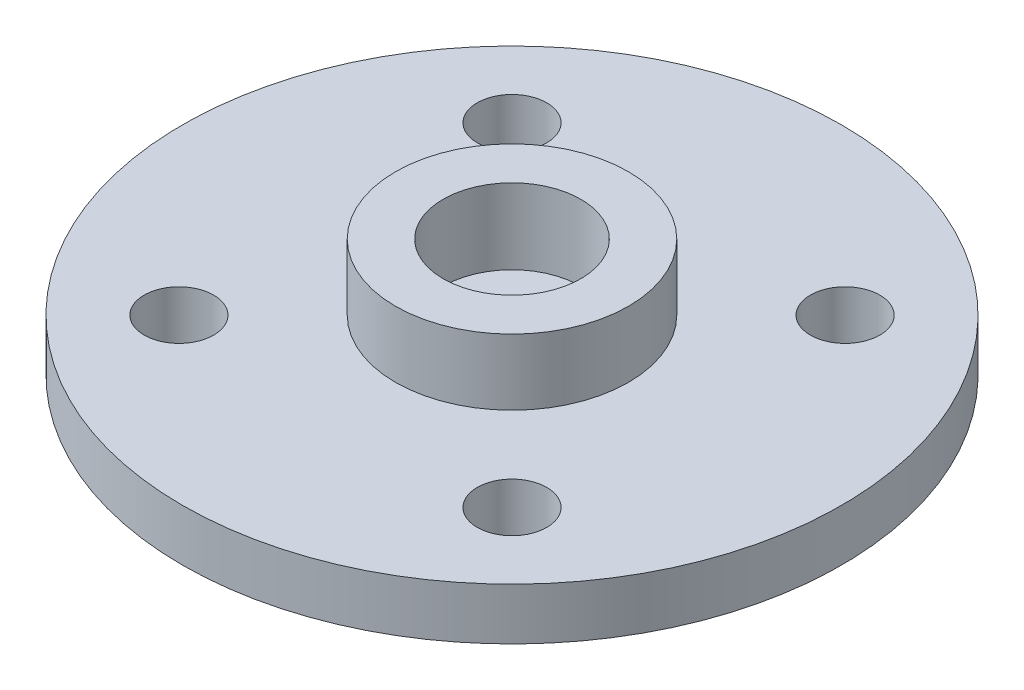
ISO-10303-21;
HEADER;
FILE_DESCRIPTION(('STEP AP214'),'2;1');
FILE_NAME('part.step','',(''),(''),'','','');
FILE_SCHEMA(('AUTOMOTIVE_DESIGN { 1 0 10303 214 1 1 1 1 }'));
ENDSEC;
DATA;
#1=APPLICATION_CONTEXT('core data for automotive mechanical design processes');
#2=APPLICATION_PROTOCOL_DEFINITION('international standard','automotive_design',2000,#1);
#3=PRODUCT_CONTEXT('',#1,'mechanical');
#4=PRODUCT('Part','Part','',(#3));
#5=PRODUCT_RELATED_PRODUCT_CATEGORY('part','',(#4));
#6=PRODUCT_DEFINITION_FORMATION('','',#4);
#7=PRODUCT_DEFINITION_CONTEXT('part definition',#1,'design');
#8=PRODUCT_DEFINITION('design','',#6,#7);
#9=PRODUCT_DEFINITION_SHAPE('','',#8);
#10=(LENGTH_UNIT() NAMED_UNIT(*) SI_UNIT(.MILLI.,.METRE.));
#11=(NAMED_UNIT(*) PLANE_ANGLE_UNIT() SI_UNIT($,.RADIAN.));
#12=(NAMED_UNIT(*) SI_UNIT($,.STERADIAN.) SOLID_ANGLE_UNIT());
#13=UNCERTAINTY_MEASURE_WITH_UNIT(LENGTH_MEASURE(1.E-05),#10,'distance_accuracy_value','');
#14=(GEOMETRIC_REPRESENTATION_CONTEXT(3) GLOBAL_UNCERTAINTY_ASSIGNED_CONTEXT((#13)) GLOBAL_UNIT_ASSIGNED_CONTEXT((#10,
#11,#12)) REPRESENTATION_CONTEXT('',''));
#15=CARTESIAN_POINT('',(0.,0.,0.));
#16=DIRECTION('',(0.,0.,1.));
#17=DIRECTION('',(1.,0.,0.));
#18=AXIS2_PLACEMENT_3D('',#15,#16,#17);
#19=CARTESIAN_POINT('',(0.,5.,0.));
#20=DIRECTION('',(0.,-1.,0.));
#21=DIRECTION('',(0.,0.,-1.));
#22=AXIS2_PLACEMENT_3D('',#19,#20,#21);
#23=CYLINDRICAL_SURFACE('',#22,1.5);
#24=DIRECTION('',(0.,-1.,0.));
#25=VECTOR('',#24,1.);
#26=CARTESIAN_POINT('',(-0.0834626338555483,5.,1.49767619622864));
#27=LINE('',#26,#25);
#28=CARTESIAN_POINT('',(-0.0834626338555482,1.,1.49767619622864));
#29=VERTEX_POINT('',#28);
#30=CARTESIAN_POINT('',(-0.0834626338555481,0.,1.49767619622864));
#31=VERTEX_POINT('',#30);
#32=EDGE_CURVE('E107',#29,#31,#27,.T.);
#33=ORIENTED_EDGE('',*,*,#32,.F.);
#34=CARTESIAN_POINT('',(0.,1.,0.));
#35=DIRECTION('',(0.,1.,0.));
#36=DIRECTION('',(0.,0.,1.));
#37=AXIS2_PLACEMENT_3D('',#34,#35,#36);
#38=CIRCLE('',#37,1.5);
#39=CARTESIAN_POINT('',(-1.49767619622864,1.,0.0834626338555488));
#40=VERTEX_POINT('',#39);
#41=EDGE_CURVE('E11',#40,#29,#38,.T.);
#42=ORIENTED_EDGE('',*,*,#41,.F.);
#43=DIRECTION('',(0.,-1.,0.));
#44=VECTOR('',#43,1.);
#45=CARTESIAN_POINT('',(-1.49767619622864,5.,0.0834626338555488));
#46=LINE('',#45,#44);
#47=CARTESIAN_POINT('',(-1.49767619622864,0.,0.0834626338555488));
#48=VERTEX_POINT('',#47);
#49=EDGE_CURVE('E104',#48,#40,#46,.F.);
#50=ORIENTED_EDGE('',*,*,#49,.F.);
#51=CARTESIAN_POINT('',(0.,0.,0.));
#52=DIRECTION('',(0.,1.,0.));
#53=DIRECTION('',(0.,0.,1.));
#54=AXIS2_PLACEMENT_3D('',#51,#52,#53);
#55=CIRCLE('',#54,1.5);
#56=EDGE_CURVE('E120',#31,#48,#55,.T.);
#57=ORIENTED_EDGE('',*,*,#56,.F.);
#58=EDGE_LOOP('',(#33,#42,#50,#57));
#59=FACE_BOUND('',#58,.T.);
#60=CARTESIAN_POINT('',(0.,1.8,0.));
#61=DIRECTION('',(0.,1.,0.));
#62=DIRECTION('',(0.,0.,1.));
#63=AXIS2_PLACEMENT_3D('',#60,#61,#62);
#64=CIRCLE('',#63,1.5);
#65=CARTESIAN_POINT('',(0.,1.8,1.5));
#66=VERTEX_POINT('',#65);
#67=EDGE_CURVE('E113',#66,#66,#64,.T.);
#68=ORIENTED_EDGE('',*,*,#67,.T.);
#69=EDGE_LOOP('',(#68));
#70=FACE_BOUND('',#69,.T.);
#71=ADVANCED_FACE('F43',(#59,#70),#23,.F.);
#72=CARTESIAN_POINT('',(0.,2.2,0.));
#73=DIRECTION('',(0.,-1.,0.));
#74=DIRECTION('',(0.,0.,-1.));
#75=AXIS2_PLACEMENT_3D('',#72,#73,#74);
#76=CYLINDRICAL_SURFACE('',#75,14.);
#77=CARTESIAN_POINT('',(0.,2.2,0.));
#78=DIRECTION('',(0.,1.,0.));
#79=DIRECTION('',(0.,0.,1.));
#80=AXIS2_PLACEMENT_3D('',#77,#78,#79);
#81=CIRCLE('',#80,14.);
#82=CARTESIAN_POINT('',(0.,2.2,14.));
#83=VERTEX_POINT('',#82);
#84=EDGE_CURVE('E136',#83,#83,#81,.T.);
#85=ORIENTED_EDGE('',*,*,#84,.F.);
#86=EDGE_LOOP('',(#85));
#87=FACE_BOUND('',#86,.T.);
#88=CARTESIAN_POINT('',(0.,0.,0.));
#89=DIRECTION('',(0.,1.,0.));
#90=DIRECTION('',(0.,0.,1.));
#91=AXIS2_PLACEMENT_3D('',#88,#89,#90);
#92=CIRCLE('',#91,14.);
#93=CARTESIAN_POINT('',(0.,0.,14.));
#94=VERTEX_POINT('',#93);
#95=EDGE_CURVE('E150',#94,#94,#92,.T.);
#96=ORIENTED_EDGE('',*,*,#95,.T.);
#97=EDGE_LOOP('',(#96));
#98=FACE_BOUND('',#97,.T.);
#99=ADVANCED_FACE('F176',(#87,#98),#76,.T.);
#100=CARTESIAN_POINT('',(-7.075,2.2,-7.07500000000002));
#101=DIRECTION('',(0.,-1.,0.));
#102=DIRECTION('',(0.,0.,-1.));
#103=AXIS2_PLACEMENT_3D('',#100,#101,#102);
#104=CYLINDRICAL_SURFACE('',#103,1.475);
#105=CARTESIAN_POINT('',(-7.075,2.2,-7.07500000000002));
#106=DIRECTION('',(0.,1.,0.));
#107=DIRECTION('',(0.,0.,1.));
#108=AXIS2_PLACEMENT_3D('',#105,#106,#107);
#109=CIRCLE('',#108,1.475);
#110=CARTESIAN_POINT('',(-7.075,2.2,-5.60000000000002));
#111=VERTEX_POINT('',#110);
#112=EDGE_CURVE('E133',#111,#111,#109,.T.);
#113=ORIENTED_EDGE('',*,*,#112,.T.);
#114=EDGE_LOOP('',(#113));
#115=FACE_BOUND('',#114,.T.);
#116=CARTESIAN_POINT('',(-7.075,0.,-7.07500000000002));
#117=DIRECTION('',(0.,1.,0.));
#118=DIRECTION('',(0.,0.,1.));
#119=AXIS2_PLACEMENT_3D('',#116,#117,#118);
#120=CIRCLE('',#119,1.475);
#121=CARTESIAN_POINT('',(-7.075,0.,-5.60000000000002));
#122=VERTEX_POINT('',#121);
#123=EDGE_CURVE('E147',#122,#122,#120,.T.);
#124=ORIENTED_EDGE('',*,*,#123,.F.);
#125=EDGE_LOOP('',(#124));
#126=FACE_BOUND('',#125,.T.);
#127=ADVANCED_FACE('F181',(#115,#126),#104,.F.);
#128=CARTESIAN_POINT('',(7.075,2.2,-7.07500000000003));
#129=DIRECTION('',(0.,-1.,0.));
#130=DIRECTION('',(0.,0.,-1.));
#131=AXIS2_PLACEMENT_3D('',#128,#129,#130);
#132=CYLINDRICAL_SURFACE('',#131,1.475);
#133=CARTESIAN_POINT('',(7.075,2.2,-7.07500000000003));
#134=DIRECTION('',(0.,1.,0.));
#135=DIRECTION('',(0.,0.,1.));
#136=AXIS2_PLACEMENT_3D('',#133,#134,#135);
#137=CIRCLE('',#136,1.475);
#138=CARTESIAN_POINT('',(7.075,2.2,-5.60000000000002));
#139=VERTEX_POINT('',#138);
#140=EDGE_CURVE('E126',#139,#139,#137,.T.);
#141=ORIENTED_EDGE('',*,*,#140,.T.);
#142=EDGE_LOOP('',(#141));
#143=FACE_BOUND('',#142,.T.);
#144=CARTESIAN_POINT('',(7.075,0.,-7.07500000000003));
#145=DIRECTION('',(0.,1.,0.));
#146=DIRECTION('',(0.,0.,1.));
#147=AXIS2_PLACEMENT_3D('',#144,#145,#146);
#148=CIRCLE('',#147,1.475);
#149=CARTESIAN_POINT('',(7.075,0.,-5.60000000000002));
#150=VERTEX_POINT('',#149);
#151=EDGE_CURVE('E144',#150,#150,#148,.T.);
#152=ORIENTED_EDGE('',*,*,#151,.F.);
#153=EDGE_LOOP('',(#152));
#154=FACE_BOUND('',#153,.T.);
#155=ADVANCED_FACE('F200',(#143,#154),#132,.F.);
#156=CARTESIAN_POINT('',(7.075,2.2,7.07500000000003));
#157=DIRECTION('',(0.,-1.,0.));
#158=DIRECTION('',(0.,0.,-1.));
#159=AXIS2_PLACEMENT_3D('',#156,#157,#158);
#160=CYLINDRICAL_SURFACE('',#159,1.475);
#161=CARTESIAN_POINT('',(7.075,2.2,7.07500000000003));
#162=DIRECTION('',(0.,1.,0.));
#163=DIRECTION('',(0.,0.,1.));
#164=AXIS2_PLACEMENT_3D('',#161,#162,#163);
#165=CIRCLE('',#164,1.475);
#166=CARTESIAN_POINT('',(7.075,2.2,8.55000000000002));
#167=VERTEX_POINT('',#166);
#168=EDGE_CURVE('E123',#167,#167,#165,.F.);
#169=ORIENTED_EDGE('',*,*,#168,.F.);
#170=EDGE_LOOP('',(#169));
#171=FACE_BOUND('',#170,.T.);
#172=CARTESIAN_POINT('',(7.075,0.,7.07500000000003));
#173=DIRECTION('',(0.,1.,0.));
#174=DIRECTION('',(0.,0.,1.));
#175=AXIS2_PLACEMENT_3D('',#172,#173,#174);
#176=CIRCLE('',#175,1.475);
#177=CARTESIAN_POINT('',(7.075,0.,8.55000000000002));
#178=VERTEX_POINT('',#177);
#179=EDGE_CURVE('E119',#178,#178,#176,.F.);
#180=ORIENTED_EDGE('',*,*,#179,.T.);
#181=EDGE_LOOP('',(#180));
#182=FACE_BOUND('',#181,.T.);
#183=ADVANCED_FACE('F45',(#171,#182),#160,.F.);
#184=CARTESIAN_POINT('',(-7.075,2.2,7.07500000000002));
#185=DIRECTION('',(0.,-1.,0.));
#186=DIRECTION('',(0.,0.,-1.));
#187=AXIS2_PLACEMENT_3D('',#184,#185,#186);
#188=CYLINDRICAL_SURFACE('',#187,1.475);
#189=CARTESIAN_POINT('',(-7.075,2.2,7.07500000000002));
#190=DIRECTION('',(0.,1.,0.));
#191=DIRECTION('',(0.,0.,1.));
#192=AXIS2_PLACEMENT_3D('',#189,#190,#191);
#193=CIRCLE('',#192,1.475);
#194=CARTESIAN_POINT('',(-7.075,2.2,8.55000000000002));
#195=VERTEX_POINT('',#194);
#196=EDGE_CURVE('E139',#195,#195,#193,.F.);
#197=ORIENTED_EDGE('',*,*,#196,.F.);
#198=EDGE_LOOP('',(#197));
#199=FACE_BOUND('',#198,.T.);
#200=CARTESIAN_POINT('',(-7.075,0.,7.07500000000002));
#201=DIRECTION('',(0.,1.,0.));
#202=DIRECTION('',(0.,0.,1.));
#203=AXIS2_PLACEMENT_3D('',#200,#201,#202);
#204=CIRCLE('',#203,1.475);
#205=CARTESIAN_POINT('',(-7.075,0.,8.55000000000002));
#206=VERTEX_POINT('',#205);
#207=EDGE_CURVE('E127',#206,#206,#204,.F.);
#208=ORIENTED_EDGE('',*,*,#207,.T.);
#209=EDGE_LOOP('',(#208));
#210=FACE_BOUND('',#209,.T.);
#211=ADVANCED_FACE('F191',(#199,#210),#188,.F.);
#212=CARTESIAN_POINT('',(0.,2.2,0.));
#213=DIRECTION('',(0.,1.,0.));
#214=DIRECTION('',(0.,0.,1.));
#215=AXIS2_PLACEMENT_3D('',#212,#213,#214);
#216=PLANE('',#215);
#217=ORIENTED_EDGE('',*,*,#168,.T.);
#218=EDGE_LOOP('',(#217));
#219=FACE_BOUND('',#218,.T.);
#220=ORIENTED_EDGE('',*,*,#140,.F.);
#221=EDGE_LOOP('',(#220));
#222=FACE_BOUND('',#221,.T.);
#223=CARTESIAN_POINT('',(0.,2.2,0.));
#224=DIRECTION('',(0.,1.,0.));
#225=DIRECTION('',(0.,0.,1.));
#226=AXIS2_PLACEMENT_3D('',#223,#224,#225);
#227=CIRCLE('',#226,4.95);
#228=CARTESIAN_POINT('',(0.,2.2,4.95));
#229=VERTEX_POINT('',#228);
#230=EDGE_CURVE('E130',#229,#229,#227,.T.);
#231=ORIENTED_EDGE('',*,*,#230,.F.);
#232=EDGE_LOOP('',(#231));
#233=FACE_BOUND('',#232,.T.);
#234=ORIENTED_EDGE('',*,*,#112,.F.);
#235=EDGE_LOOP('',(#234));
#236=FACE_BOUND('',#235,.T.);
#237=ORIENTED_EDGE('',*,*,#84,.T.);
#238=EDGE_LOOP('',(#237));
#239=FACE_BOUND('',#238,.T.);
#240=ORIENTED_EDGE('',*,*,#196,.T.);
#241=EDGE_LOOP('',(#240));
#242=FACE_BOUND('',#241,.T.);
#243=ADVANCED_FACE('F188',(#219,#222,#233,#236,#239,#242),#216,.T.);
#244=CARTESIAN_POINT('',(0.,0.,0.));
#245=DIRECTION('',(0.,1.,0.));
#246=DIRECTION('',(0.,0.,1.));
#247=AXIS2_PLACEMENT_3D('',#244,#245,#246);
#248=PLANE('',#247);
#249=ORIENTED_EDGE('',*,*,#179,.F.);
#250=EDGE_LOOP('',(#249));
#251=FACE_BOUND('',#250,.T.);
#252=ORIENTED_EDGE('',*,*,#151,.T.);
#253=EDGE_LOOP('',(#252));
#254=FACE_BOUND('',#253,.T.);
#255=ORIENTED_EDGE('',*,*,#123,.T.);
#256=EDGE_LOOP('',(#255));
#257=FACE_BOUND('',#256,.T.);
#258=ORIENTED_EDGE('',*,*,#95,.F.);
#259=EDGE_LOOP('',(#258));
#260=FACE_BOUND('',#259,.T.);
#261=ORIENTED_EDGE('',*,*,#207,.F.);
#262=EDGE_LOOP('',(#261));
#263=FACE_BOUND('',#262,.T.);
#264=DIRECTION('',(-0.707106781186548,0.,-0.707106781186548));
#265=VECTOR('',#264,1.);
#266=CARTESIAN_POINT('',(-2.82842712474619,0.,1.4142135623731));
#267=LINE('',#266,#265);
#268=CARTESIAN_POINT('',(-1.4142135623731,0.,2.82842712474619));
#269=VERTEX_POINT('',#268);
#270=CARTESIAN_POINT('',(-2.82842712474619,0.,1.4142135623731));
#271=VERTEX_POINT('',#270);
#272=EDGE_CURVE('E101',#269,#271,#267,.T.);
#273=ORIENTED_EDGE('',*,*,#272,.F.);
#274=DIRECTION('',(0.707106781186547,0.,-0.707106781186548));
#275=VECTOR('',#274,1.);
#276=CARTESIAN_POINT('',(0.707106781186547,0.,0.707106781186547));
#277=LINE('',#276,#275);
#278=EDGE_CURVE('E51',#269,#31,#277,.T.);
#279=ORIENTED_EDGE('',*,*,#278,.T.);
#280=ORIENTED_EDGE('',*,*,#56,.T.);
#281=DIRECTION('',(0.707106781186548,0.,-0.707106781186547));
#282=VECTOR('',#281,1.);
#283=CARTESIAN_POINT('',(-0.707106781186546,0.,-0.707106781186547));
#284=LINE('',#283,#282);
#285=EDGE_CURVE('E88',#271,#48,#284,.T.);
#286=ORIENTED_EDGE('',*,*,#285,.F.);
#287=EDGE_LOOP('',(#273,#279,#280,#286));
#288=FACE_BOUND('',#287,.T.);
#289=ADVANCED_FACE('F158',(#251,#254,#257,#260,#263,#288),#248,.F.);
#290=CARTESIAN_POINT('',(0.,5.,0.));
#291=DIRECTION('',(0.,-1.,0.));
#292=DIRECTION('',(0.,0.,-1.));
#293=AXIS2_PLACEMENT_3D('',#290,#291,#292);
#294=CYLINDRICAL_SURFACE('',#293,4.95);
#295=ORIENTED_EDGE('',*,*,#230,.T.);
#296=EDGE_LOOP('',(#295));
#297=FACE_BOUND('',#296,.T.);
#298=CARTESIAN_POINT('',(0.,5.,0.));
#299=DIRECTION('',(0.,1.,0.));
#300=DIRECTION('',(0.,0.,1.));
#301=AXIS2_PLACEMENT_3D('',#298,#299,#300);
#302=CIRCLE('',#301,4.95);
#303=CARTESIAN_POINT('',(0.,5.,4.95));
#304=VERTEX_POINT('',#303);
#305=EDGE_CURVE('E116',#304,#304,#302,.T.);
#306=ORIENTED_EDGE('',*,*,#305,.F.);
#307=EDGE_LOOP('',(#306));
#308=FACE_BOUND('',#307,.T.);
#309=ADVANCED_FACE('F186',(#297,#308),#294,.T.);
#310=CARTESIAN_POINT('',(0.,5.,0.));
#311=DIRECTION('',(0.,1.,0.));
#312=DIRECTION('',(0.,0.,1.));
#313=AXIS2_PLACEMENT_3D('',#310,#311,#312);
#314=PLANE('',#313);
#315=CARTESIAN_POINT('',(0.,5.,0.));
#316=DIRECTION('',(0.,1.,0.));
#317=DIRECTION('',(0.,0.,1.));
#318=AXIS2_PLACEMENT_3D('',#315,#316,#317);
#319=CIRCLE('',#318,2.925);
#320=CARTESIAN_POINT('',(0.,5.,2.925));
#321=VERTEX_POINT('',#320);
#322=EDGE_CURVE('E109',#321,#321,#319,.T.);
#323=ORIENTED_EDGE('',*,*,#322,.F.);
#324=EDGE_LOOP('',(#323));
#325=FACE_BOUND('',#324,.T.);
#326=ORIENTED_EDGE('',*,*,#305,.T.);
#327=EDGE_LOOP('',(#326));
#328=FACE_BOUND('',#327,.T.);
#329=ADVANCED_FACE('F233',(#325,#328),#314,.T.);
#330=CARTESIAN_POINT('',(0.,1.8,0.));
#331=DIRECTION('',(0.,1.,0.));
#332=DIRECTION('',(0.,0.,1.));
#333=AXIS2_PLACEMENT_3D('',#330,#331,#332);
#334=CYLINDRICAL_SURFACE('',#333,2.925);
#335=CARTESIAN_POINT('',(0.,1.8,0.));
#336=DIRECTION('',(0.,1.,0.));
#337=DIRECTION('',(0.,0.,1.));
#338=AXIS2_PLACEMENT_3D('',#335,#336,#337);
#339=CIRCLE('',#338,2.925);
#340=CARTESIAN_POINT('',(0.,1.8,2.925));
#341=VERTEX_POINT('',#340);
#342=EDGE_CURVE('E110',#341,#341,#339,.T.);
#343=ORIENTED_EDGE('',*,*,#342,.F.);
#344=EDGE_LOOP('',(#343));
#345=FACE_BOUND('',#344,.T.);
#346=ORIENTED_EDGE('',*,*,#322,.T.);
#347=EDGE_LOOP('',(#346));
#348=FACE_BOUND('',#347,.T.);
#349=ADVANCED_FACE('F237',(#345,#348),#334,.F.);
#350=CARTESIAN_POINT('',(0.,1.8,0.));
#351=DIRECTION('',(0.,1.,0.));
#352=DIRECTION('',(0.,0.,1.));
#353=AXIS2_PLACEMENT_3D('',#350,#351,#352);
#354=PLANE('',#353);
#355=ORIENTED_EDGE('',*,*,#67,.F.);
#356=EDGE_LOOP('',(#355));
#357=FACE_BOUND('',#356,.T.);
#358=ORIENTED_EDGE('',*,*,#342,.T.);
#359=EDGE_LOOP('',(#358));
#360=FACE_BOUND('',#359,.T.);
#361=ADVANCED_FACE('F172',(#357,#360),#354,.T.);
#362=CARTESIAN_POINT('',(0.707106781186548,1.,0.707106781186546));
#363=DIRECTION('',(0.707106781186548,0.,0.707106781186547));
#364=DIRECTION('',(0.707106781186547,0.,-0.707106781186548));
#365=AXIS2_PLACEMENT_3D('',#362,#363,#364);
#366=PLANE('',#365);
#367=ORIENTED_EDGE('',*,*,#32,.T.);
#368=ORIENTED_EDGE('',*,*,#278,.F.);
#369=DIRECTION('',(0.,-1.,0.));
#370=VECTOR('',#369,1.);
#371=CARTESIAN_POINT('',(-1.4142135623731,1.,2.82842712474619));
#372=LINE('',#371,#370);
#373=CARTESIAN_POINT('',(-1.4142135623731,1.,2.82842712474619));
#374=VERTEX_POINT('',#373);
#375=EDGE_CURVE('E58',#374,#269,#372,.T.);
#376=ORIENTED_EDGE('',*,*,#375,.F.);
#377=DIRECTION('',(-0.707106781186547,0.,0.707106781186548));
#378=VECTOR('',#377,1.);
#379=CARTESIAN_POINT('',(0.707106781186548,1.,0.707106781186546));
#380=LINE('',#379,#378);
#381=EDGE_CURVE('E83',#29,#374,#380,.T.);
#382=ORIENTED_EDGE('',*,*,#381,.F.);
#383=EDGE_LOOP('',(#367,#368,#376,#382));
#384=FACE_BOUND('',#383,.T.);
#385=ADVANCED_FACE('F90',(#384),#366,.F.);
#386=CARTESIAN_POINT('',(-0.707106781186546,1.,-0.707106781186547));
#387=DIRECTION('',(-0.707106781186547,0.,-0.707106781186548));
#388=DIRECTION('',(-0.707106781186548,0.,0.707106781186547));
#389=AXIS2_PLACEMENT_3D('',#386,#387,#388);
#390=PLANE('',#389);
#391=ORIENTED_EDGE('',*,*,#49,.T.);
#392=DIRECTION('',(0.707106781186548,0.,-0.707106781186547));
#393=VECTOR('',#392,1.);
#394=CARTESIAN_POINT('',(-0.707106781186546,1.,-0.707106781186547));
#395=LINE('',#394,#393);
#396=CARTESIAN_POINT('',(-2.82842712474619,1.,1.4142135623731));
#397=VERTEX_POINT('',#396);
#398=EDGE_CURVE('E94',#397,#40,#395,.T.);
#399=ORIENTED_EDGE('',*,*,#398,.F.);
#400=DIRECTION('',(0.,-1.,0.));
#401=VECTOR('',#400,1.);
#402=CARTESIAN_POINT('',(-2.82842712474619,1.,1.4142135623731));
#403=LINE('',#402,#401);
#404=EDGE_CURVE('E93',#397,#271,#403,.T.);
#405=ORIENTED_EDGE('',*,*,#404,.T.);
#406=ORIENTED_EDGE('',*,*,#285,.T.);
#407=EDGE_LOOP('',(#391,#399,#405,#406));
#408=FACE_BOUND('',#407,.T.);
#409=ADVANCED_FACE('F164',(#408),#390,.F.);
#410=CARTESIAN_POINT('',(-2.82842712474619,1.,1.4142135623731));
#411=DIRECTION('',(-0.707106781186547,0.,0.707106781186547));
#412=DIRECTION('',(0.707106781186548,0.,0.707106781186548));
#413=AXIS2_PLACEMENT_3D('',#410,#411,#412);
#414=PLANE('',#413);
#415=ORIENTED_EDGE('',*,*,#272,.T.);
#416=ORIENTED_EDGE('',*,*,#404,.F.);
#417=DIRECTION('',(-0.707106781186548,0.,-0.707106781186548));
#418=VECTOR('',#417,1.);
#419=CARTESIAN_POINT('',(-2.82842712474619,1.,1.4142135623731));
#420=LINE('',#419,#418);
#421=EDGE_CURVE('E85',#374,#397,#420,.T.);
#422=ORIENTED_EDGE('',*,*,#421,.F.);
#423=ORIENTED_EDGE('',*,*,#375,.T.);
#424=EDGE_LOOP('',(#415,#416,#422,#423));
#425=FACE_BOUND('',#424,.T.);
#426=ADVANCED_FACE('F96',(#425),#414,.F.);
#427=CARTESIAN_POINT('',(0.,1.,0.));
#428=DIRECTION('',(0.,1.,0.));
#429=DIRECTION('',(0.,0.,1.));
#430=AXIS2_PLACEMENT_3D('',#427,#428,#429);
#431=PLANE('',#430);
#432=ORIENTED_EDGE('',*,*,#41,.T.);
#433=ORIENTED_EDGE('',*,*,#381,.T.);
#434=ORIENTED_EDGE('',*,*,#421,.T.);
#435=ORIENTED_EDGE('',*,*,#398,.T.);
#436=EDGE_LOOP('',(#432,#433,#434,#435));
#437=FACE_BOUND('',#436,.T.);
#438=ADVANCED_FACE('F84',(#437),#431,.F.);
#439=CLOSED_SHELL('',(#71,#99,#127,#155,#183,#211,#243,#289,#309,#329,#349,#361,#385,#409,#426,#438));
#440=MANIFOLD_SOLID_BREP('B2',#439);
#441=ADVANCED_BREP_SHAPE_REPRESENTATION('',(#18,#440),#14);
#442=SHAPE_DEFINITION_REPRESENTATION(#9,#441);
ENDSEC;
END-ISO-10303-21;
